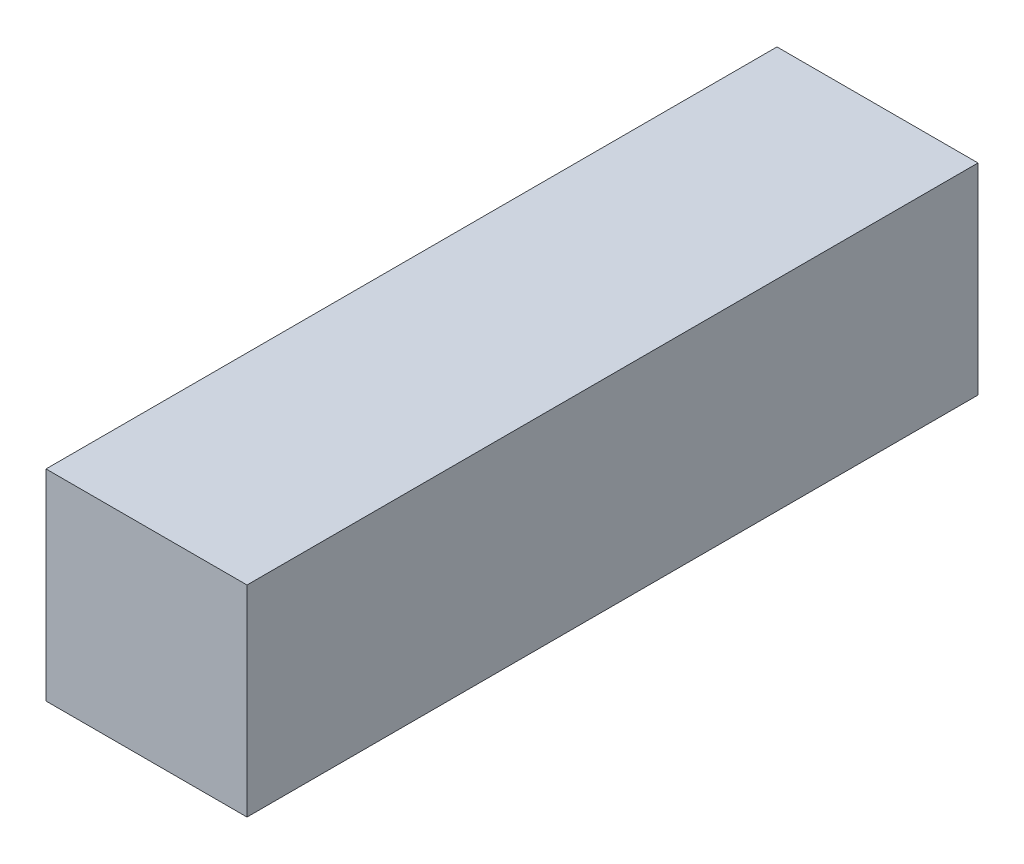
ISO-10303-21;
HEADER;
FILE_DESCRIPTION(('STEP AP214'),'2;1');
FILE_NAME('part.step','',(''),(''),'','','');
FILE_SCHEMA(('AUTOMOTIVE_DESIGN { 1 0 10303 214 1 1 1 1 }'));
ENDSEC;
DATA;
#1=APPLICATION_CONTEXT('core data for automotive mechanical design processes');
#2=APPLICATION_PROTOCOL_DEFINITION('international standard','automotive_design',2000,#1);
#3=PRODUCT_CONTEXT('',#1,'mechanical');
#4=PRODUCT('Part','Part','',(#3));
#5=PRODUCT_RELATED_PRODUCT_CATEGORY('part','',(#4));
#6=PRODUCT_DEFINITION_FORMATION('','',#4);
#7=PRODUCT_DEFINITION_CONTEXT('part definition',#1,'design');
#8=PRODUCT_DEFINITION('design','',#6,#7);
#9=PRODUCT_DEFINITION_SHAPE('','',#8);
#10=(LENGTH_UNIT() NAMED_UNIT(*) SI_UNIT(.MILLI.,.METRE.));
#11=(NAMED_UNIT(*) PLANE_ANGLE_UNIT() SI_UNIT($,.RADIAN.));
#12=(NAMED_UNIT(*) SI_UNIT($,.STERADIAN.) SOLID_ANGLE_UNIT());
#13=UNCERTAINTY_MEASURE_WITH_UNIT(LENGTH_MEASURE(1.E-05),#10,'distance_accuracy_value','');
#14=(GEOMETRIC_REPRESENTATION_CONTEXT(3) GLOBAL_UNCERTAINTY_ASSIGNED_CONTEXT((#13)) GLOBAL_UNIT_ASSIGNED_CONTEXT((#10,
#11,#12)) REPRESENTATION_CONTEXT('',''));
#15=CARTESIAN_POINT('',(0.,0.,0.));
#16=DIRECTION('',(0.,0.,1.));
#17=DIRECTION('',(1.,0.,0.));
#18=AXIS2_PLACEMENT_3D('',#15,#16,#17);
#19=CARTESIAN_POINT('',(11.,11.,80.));
#20=DIRECTION('',(-1.,0.,0.));
#21=DIRECTION('',(0.,-1.,0.));
#22=AXIS2_PLACEMENT_3D('',#19,#20,#21);
#23=PLANE('',#22);
#24=DIRECTION('',(0.,1.,0.));
#25=VECTOR('',#24,1.);
#26=CARTESIAN_POINT('',(11.,11.,0.));
#27=LINE('',#26,#25);
#28=CARTESIAN_POINT('',(11.,-11.,0.));
#29=VERTEX_POINT('',#28);
#30=CARTESIAN_POINT('',(11.,11.,0.));
#31=VERTEX_POINT('',#30);
#32=EDGE_CURVE('E95',#29,#31,#27,.T.);
#33=ORIENTED_EDGE('',*,*,#32,.T.);
#34=DIRECTION('',(0.,0.,-1.));
#35=VECTOR('',#34,1.);
#36=CARTESIAN_POINT('',(11.,11.,80.));
#37=LINE('',#36,#35);
#38=CARTESIAN_POINT('',(11.,11.,80.));
#39=VERTEX_POINT('',#38);
#40=EDGE_CURVE('E11',#39,#31,#37,.T.);
#41=ORIENTED_EDGE('',*,*,#40,.F.);
#42=DIRECTION('',(0.,1.,0.));
#43=VECTOR('',#42,1.);
#44=CARTESIAN_POINT('',(11.,11.,80.));
#45=LINE('',#44,#43);
#46=CARTESIAN_POINT('',(11.,-11.,80.));
#47=VERTEX_POINT('',#46);
#48=EDGE_CURVE('E83',#47,#39,#45,.T.);
#49=ORIENTED_EDGE('',*,*,#48,.F.);
#50=DIRECTION('',(0.,0.,-1.));
#51=VECTOR('',#50,1.);
#52=CARTESIAN_POINT('',(11.,-11.,80.));
#53=LINE('',#52,#51);
#54=EDGE_CURVE('E91',#47,#29,#53,.T.);
#55=ORIENTED_EDGE('',*,*,#54,.T.);
#56=EDGE_LOOP('',(#33,#41,#49,#55));
#57=FACE_BOUND('',#56,.T.);
#58=ADVANCED_FACE('F32',(#57),#23,.F.);
#59=CARTESIAN_POINT('',(-11.,11.,80.));
#60=DIRECTION('',(0.,-1.,0.));
#61=DIRECTION('',(0.,0.,-1.));
#62=AXIS2_PLACEMENT_3D('',#59,#60,#61);
#63=PLANE('',#62);
#64=DIRECTION('',(-1.,0.,0.));
#65=VECTOR('',#64,1.);
#66=CARTESIAN_POINT('',(-11.,11.,0.));
#67=LINE('',#66,#65);
#68=CARTESIAN_POINT('',(-11.,11.,0.));
#69=VERTEX_POINT('',#68);
#70=EDGE_CURVE('E87',#31,#69,#67,.T.);
#71=ORIENTED_EDGE('',*,*,#70,.T.);
#72=DIRECTION('',(0.,0.,-1.));
#73=VECTOR('',#72,1.);
#74=CARTESIAN_POINT('',(-11.,11.,80.));
#75=LINE('',#74,#73);
#76=CARTESIAN_POINT('',(-11.,11.,80.));
#77=VERTEX_POINT('',#76);
#78=EDGE_CURVE('E40',#77,#69,#75,.T.);
#79=ORIENTED_EDGE('',*,*,#78,.F.);
#80=DIRECTION('',(-1.,0.,0.));
#81=VECTOR('',#80,1.);
#82=CARTESIAN_POINT('',(-11.,11.,80.));
#83=LINE('',#82,#81);
#84=EDGE_CURVE('E78',#39,#77,#83,.T.);
#85=ORIENTED_EDGE('',*,*,#84,.F.);
#86=ORIENTED_EDGE('',*,*,#40,.T.);
#87=EDGE_LOOP('',(#71,#79,#85,#86));
#88=FACE_BOUND('',#87,.T.);
#89=ADVANCED_FACE('F86',(#88),#63,.F.);
#90=CARTESIAN_POINT('',(-11.,11.,80.));
#91=DIRECTION('',(1.,0.,0.));
#92=DIRECTION('',(0.,1.,0.));
#93=AXIS2_PLACEMENT_3D('',#90,#91,#92);
#94=PLANE('',#93);
#95=DIRECTION('',(0.,-1.,0.));
#96=VECTOR('',#95,1.);
#97=CARTESIAN_POINT('',(-11.,11.,0.));
#98=LINE('',#97,#96);
#99=CARTESIAN_POINT('',(-11.,-11.,0.));
#100=VERTEX_POINT('',#99);
#101=EDGE_CURVE('E65',#69,#100,#98,.T.);
#102=ORIENTED_EDGE('',*,*,#101,.T.);
#103=DIRECTION('',(0.,0.,-1.));
#104=VECTOR('',#103,1.);
#105=CARTESIAN_POINT('',(-11.,-11.,80.));
#106=LINE('',#105,#104);
#107=CARTESIAN_POINT('',(-11.,-11.,80.));
#108=VERTEX_POINT('',#107);
#109=EDGE_CURVE('E88',#108,#100,#106,.T.);
#110=ORIENTED_EDGE('',*,*,#109,.F.);
#111=DIRECTION('',(0.,-1.,0.));
#112=VECTOR('',#111,1.);
#113=CARTESIAN_POINT('',(-11.,11.,80.));
#114=LINE('',#113,#112);
#115=EDGE_CURVE('E81',#77,#108,#114,.T.);
#116=ORIENTED_EDGE('',*,*,#115,.F.);
#117=ORIENTED_EDGE('',*,*,#78,.T.);
#118=EDGE_LOOP('',(#102,#110,#116,#117));
#119=FACE_BOUND('',#118,.T.);
#120=ADVANCED_FACE('F89',(#119),#94,.F.);
#121=CARTESIAN_POINT('',(-11.,-11.,80.));
#122=DIRECTION('',(0.,1.,0.));
#123=DIRECTION('',(0.,0.,1.));
#124=AXIS2_PLACEMENT_3D('',#121,#122,#123);
#125=PLANE('',#124);
#126=DIRECTION('',(1.,0.,0.));
#127=VECTOR('',#126,1.);
#128=CARTESIAN_POINT('',(-11.,-11.,0.));
#129=LINE('',#128,#127);
#130=EDGE_CURVE('E71',#100,#29,#129,.T.);
#131=ORIENTED_EDGE('',*,*,#130,.T.);
#132=ORIENTED_EDGE('',*,*,#54,.F.);
#133=DIRECTION('',(1.,0.,0.));
#134=VECTOR('',#133,1.);
#135=CARTESIAN_POINT('',(-11.,-11.,80.));
#136=LINE('',#135,#134);
#137=EDGE_CURVE('E48',#108,#47,#136,.T.);
#138=ORIENTED_EDGE('',*,*,#137,.F.);
#139=ORIENTED_EDGE('',*,*,#109,.T.);
#140=EDGE_LOOP('',(#131,#132,#138,#139));
#141=FACE_BOUND('',#140,.T.);
#142=ADVANCED_FACE('F102',(#141),#125,.F.);
#143=CARTESIAN_POINT('',(0.,0.,80.));
#144=DIRECTION('',(0.,0.,1.));
#145=DIRECTION('',(1.,0.,0.));
#146=AXIS2_PLACEMENT_3D('',#143,#144,#145);
#147=PLANE('',#146);
#148=ORIENTED_EDGE('',*,*,#48,.T.);
#149=ORIENTED_EDGE('',*,*,#84,.T.);
#150=ORIENTED_EDGE('',*,*,#115,.T.);
#151=ORIENTED_EDGE('',*,*,#137,.T.);
#152=EDGE_LOOP('',(#148,#149,#150,#151));
#153=FACE_BOUND('',#152,.T.);
#154=ADVANCED_FACE('F79',(#153),#147,.T.);
#155=CARTESIAN_POINT('',(0.,0.,0.));
#156=DIRECTION('',(0.,0.,1.));
#157=DIRECTION('',(1.,0.,0.));
#158=AXIS2_PLACEMENT_3D('',#155,#156,#157);
#159=PLANE('',#158);
#160=ORIENTED_EDGE('',*,*,#32,.F.);
#161=ORIENTED_EDGE('',*,*,#130,.F.);
#162=ORIENTED_EDGE('',*,*,#101,.F.);
#163=ORIENTED_EDGE('',*,*,#70,.F.);
#164=EDGE_LOOP('',(#160,#161,#162,#163));
#165=FACE_BOUND('',#164,.T.);
#166=ADVANCED_FACE('F105',(#165),#159,.F.);
#167=CLOSED_SHELL('',(#58,#89,#120,#142,#154,#166));
#168=MANIFOLD_SOLID_BREP('B2',#167);
#169=ADVANCED_BREP_SHAPE_REPRESENTATION('',(#18,#168),#14);
#170=SHAPE_DEFINITION_REPRESENTATION(#9,#169);
ENDSEC;
END-ISO-10303-21;
